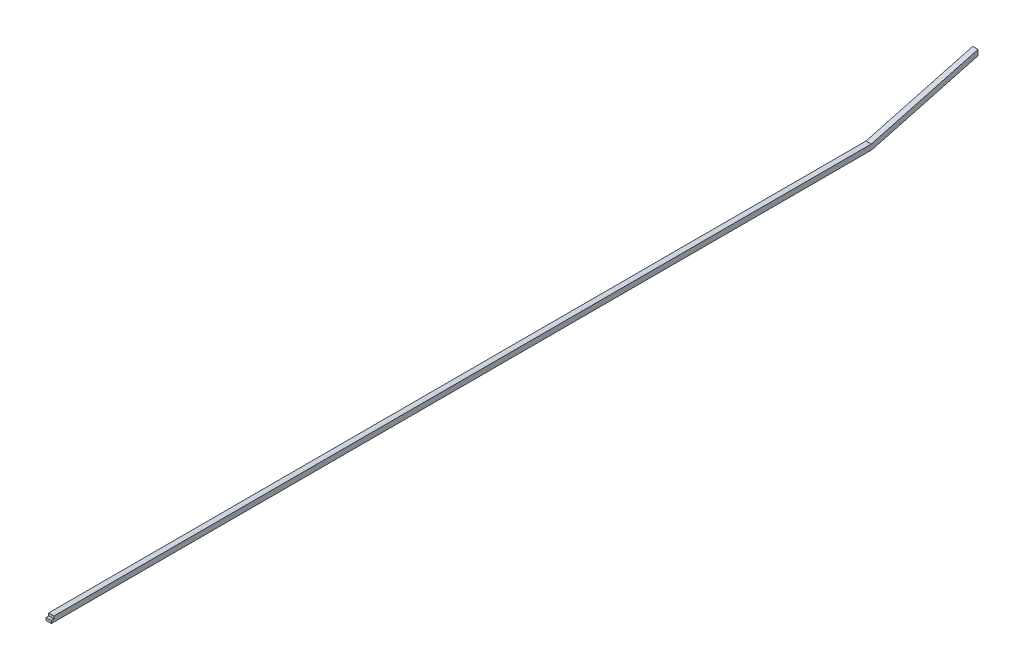
ISO-10303-21;
HEADER;
FILE_DESCRIPTION(('STEP AP214'),'2;1');
FILE_NAME('part.step','',(''),(''),'','','');
FILE_SCHEMA(('AUTOMOTIVE_DESIGN { 1 0 10303 214 1 1 1 1 }'));
ENDSEC;
DATA;
#1=APPLICATION_CONTEXT('core data for automotive mechanical design processes');
#2=APPLICATION_PROTOCOL_DEFINITION('international standard','automotive_design',2000,#1);
#3=PRODUCT_CONTEXT('',#1,'mechanical');
#4=PRODUCT('Part','Part','',(#3));
#5=PRODUCT_RELATED_PRODUCT_CATEGORY('part','',(#4));
#6=PRODUCT_DEFINITION_FORMATION('','',#4);
#7=PRODUCT_DEFINITION_CONTEXT('part definition',#1,'design');
#8=PRODUCT_DEFINITION('design','',#6,#7);
#9=PRODUCT_DEFINITION_SHAPE('','',#8);
#10=(LENGTH_UNIT() NAMED_UNIT(*) SI_UNIT(.MILLI.,.METRE.));
#11=(NAMED_UNIT(*) PLANE_ANGLE_UNIT() SI_UNIT($,.RADIAN.));
#12=(NAMED_UNIT(*) SI_UNIT($,.STERADIAN.) SOLID_ANGLE_UNIT());
#13=UNCERTAINTY_MEASURE_WITH_UNIT(LENGTH_MEASURE(1.E-05),#10,'distance_accuracy_value','');
#14=(GEOMETRIC_REPRESENTATION_CONTEXT(3) GLOBAL_UNCERTAINTY_ASSIGNED_CONTEXT((#13)) GLOBAL_UNIT_ASSIGNED_CONTEXT((#10,
#11,#12)) REPRESENTATION_CONTEXT('',''));
#15=CARTESIAN_POINT('',(0.,0.,0.));
#16=DIRECTION('',(0.,0.,1.));
#17=DIRECTION('',(1.,0.,0.));
#18=AXIS2_PLACEMENT_3D('',#15,#16,#17);
#19=CARTESIAN_POINT('',(6.,0.,413.95698399326));
#20=DIRECTION('',(0.,0.,-1.));
#21=DIRECTION('',(-1.,0.,0.));
#22=AXIS2_PLACEMENT_3D('',#19,#20,#21);
#23=PLANE('',#22);
#24=DIRECTION('',(0.,-1.,0.));
#25=VECTOR('',#24,1.);
#26=CARTESIAN_POINT('',(0.,0.,413.95698399326));
#27=LINE('',#26,#25);
#28=CARTESIAN_POINT('',(0.,3.,413.95698399326));
#29=VERTEX_POINT('',#28);
#30=CARTESIAN_POINT('',(0.,0.,413.95698399326));
#31=VERTEX_POINT('',#30);
#32=EDGE_CURVE('E144',#29,#31,#27,.T.);
#33=ORIENTED_EDGE('',*,*,#32,.T.);
#34=DIRECTION('',(-1.,0.,0.));
#35=VECTOR('',#34,1.);
#36=CARTESIAN_POINT('',(6.,0.,413.95698399326));
#37=LINE('',#36,#35);
#38=CARTESIAN_POINT('',(6.,0.,413.95698399326));
#39=VERTEX_POINT('',#38);
#40=EDGE_CURVE('E11',#39,#31,#37,.T.);
#41=ORIENTED_EDGE('',*,*,#40,.F.);
#42=DIRECTION('',(0.,-1.,0.));
#43=VECTOR('',#42,1.);
#44=CARTESIAN_POINT('',(6.,0.,413.95698399326));
#45=LINE('',#44,#43);
#46=CARTESIAN_POINT('',(6.,3.,413.95698399326));
#47=VERTEX_POINT('',#46);
#48=EDGE_CURVE('E166',#47,#39,#45,.T.);
#49=ORIENTED_EDGE('',*,*,#48,.F.);
#50=DIRECTION('',(-1.,0.,0.));
#51=VECTOR('',#50,1.);
#52=CARTESIAN_POINT('',(6.,3.,413.95698399326));
#53=LINE('',#52,#51);
#54=EDGE_CURVE('E140',#47,#29,#53,.T.);
#55=ORIENTED_EDGE('',*,*,#54,.T.);
#56=EDGE_LOOP('',(#33,#41,#49,#55));
#57=FACE_BOUND('',#56,.T.);
#58=ADVANCED_FACE('F43',(#57),#23,.F.);
#59=CARTESIAN_POINT('',(6.,0.,413.95698399326));
#60=DIRECTION('',(0.,1.,0.));
#61=DIRECTION('',(0.,0.,1.));
#62=AXIS2_PLACEMENT_3D('',#59,#60,#61);
#63=PLANE('',#62);
#64=DIRECTION('',(0.,0.,-1.));
#65=VECTOR('',#64,1.);
#66=CARTESIAN_POINT('',(0.,0.,413.95698399326));
#67=LINE('',#66,#65);
#68=CARTESIAN_POINT('',(0.,0.,-514.90301600674));
#69=VERTEX_POINT('',#68);
#70=EDGE_CURVE('E148',#31,#69,#67,.T.);
#71=ORIENTED_EDGE('',*,*,#70,.T.);
#72=DIRECTION('',(-1.,0.,0.));
#73=VECTOR('',#72,1.);
#74=CARTESIAN_POINT('',(6.,0.,-514.90301600674));
#75=LINE('',#74,#73);
#76=CARTESIAN_POINT('',(6.,0.,-514.90301600674));
#77=VERTEX_POINT('',#76);
#78=EDGE_CURVE('E52',#77,#69,#75,.T.);
#79=ORIENTED_EDGE('',*,*,#78,.F.);
#80=DIRECTION('',(0.,0.,-1.));
#81=VECTOR('',#80,1.);
#82=CARTESIAN_POINT('',(6.,0.,413.95698399326));
#83=LINE('',#82,#81);
#84=EDGE_CURVE('E103',#39,#77,#83,.T.);
#85=ORIENTED_EDGE('',*,*,#84,.F.);
#86=ORIENTED_EDGE('',*,*,#40,.T.);
#87=EDGE_LOOP('',(#71,#79,#85,#86));
#88=FACE_BOUND('',#87,.T.);
#89=ADVANCED_FACE('F212',(#88),#63,.F.);
#90=CARTESIAN_POINT('',(6.,0.,-514.90301600674));
#91=DIRECTION('',(0.,0.965925826289068,0.258819045102521));
#92=DIRECTION('',(0.,-0.258819045102521,0.965925826289068));
#93=AXIS2_PLACEMENT_3D('',#90,#91,#92);
#94=PLANE('',#93);
#95=DIRECTION('',(0.,0.258819045102521,-0.965925826289068));
#96=VECTOR('',#95,1.);
#97=CARTESIAN_POINT('',(0.,0.,-514.90301600674));
#98=LINE('',#97,#96);
#99=CARTESIAN_POINT('',(0.,32.1530899730862,-634.899981406631));
#100=VERTEX_POINT('',#99);
#101=EDGE_CURVE('E151',#69,#100,#98,.T.);
#102=ORIENTED_EDGE('',*,*,#101,.T.);
#103=DIRECTION('',(-1.,0.,0.));
#104=VECTOR('',#103,1.);
#105=CARTESIAN_POINT('',(6.,32.1530899730862,-634.899981406631));
#106=LINE('',#105,#104);
#107=CARTESIAN_POINT('',(6.,32.1530899730862,-634.899981406631));
#108=VERTEX_POINT('',#107);
#109=EDGE_CURVE('E177',#108,#100,#106,.T.);
#110=ORIENTED_EDGE('',*,*,#109,.F.);
#111=DIRECTION('',(0.,0.258819045102521,-0.965925826289068));
#112=VECTOR('',#111,1.);
#113=CARTESIAN_POINT('',(6.,0.,-514.90301600674));
#114=LINE('',#113,#112);
#115=EDGE_CURVE('E187',#77,#108,#114,.T.);
#116=ORIENTED_EDGE('',*,*,#115,.F.);
#117=ORIENTED_EDGE('',*,*,#78,.T.);
#118=EDGE_LOOP('',(#102,#110,#116,#117));
#119=FACE_BOUND('',#118,.T.);
#120=ADVANCED_FACE('F185',(#119),#94,.F.);
#121=CARTESIAN_POINT('',(6.,32.1530899730862,-634.899981406631));
#122=DIRECTION('',(0.,0.,1.));
#123=DIRECTION('',(1.,0.,0.));
#124=AXIS2_PLACEMENT_3D('',#121,#122,#123);
#125=PLANE('',#124);
#126=DIRECTION('',(0.,1.,0.));
#127=VECTOR('',#126,1.);
#128=CARTESIAN_POINT('',(0.,32.1530899730862,-634.899981406631));
#129=LINE('',#128,#127);
#130=CARTESIAN_POINT('',(0.,38.3647470555468,-634.899981406631));
#131=VERTEX_POINT('',#130);
#132=EDGE_CURVE('E154',#100,#131,#129,.T.);
#133=ORIENTED_EDGE('',*,*,#132,.T.);
#134=DIRECTION('',(-1.,0.,0.));
#135=VECTOR('',#134,1.);
#136=CARTESIAN_POINT('',(6.,38.3647470555468,-634.899981406631));
#137=LINE('',#136,#135);
#138=CARTESIAN_POINT('',(6.,38.3647470555468,-634.899981406631));
#139=VERTEX_POINT('',#138);
#140=EDGE_CURVE('E173',#139,#131,#137,.T.);
#141=ORIENTED_EDGE('',*,*,#140,.F.);
#142=DIRECTION('',(0.,1.,0.));
#143=VECTOR('',#142,1.);
#144=CARTESIAN_POINT('',(6.,32.1530899730862,-634.899981406631));
#145=LINE('',#144,#143);
#146=EDGE_CURVE('E200',#108,#139,#145,.T.);
#147=ORIENTED_EDGE('',*,*,#146,.F.);
#148=ORIENTED_EDGE('',*,*,#109,.T.);
#149=EDGE_LOOP('',(#133,#141,#147,#148));
#150=FACE_BOUND('',#149,.T.);
#151=ADVANCED_FACE('F195',(#150),#125,.F.);
#152=CARTESIAN_POINT('',(6.,6.,-514.113101021215));
#153=DIRECTION('',(0.,-0.965925826289068,-0.258819045102522));
#154=DIRECTION('',(0.,0.258819045102522,-0.965925826289068));
#155=AXIS2_PLACEMENT_3D('',#152,#153,#154);
#156=PLANE('',#155);
#157=DIRECTION('',(0.,-0.258819045102522,0.965925826289068));
#158=VECTOR('',#157,1.);
#159=CARTESIAN_POINT('',(0.,6.,-514.113101021215));
#160=LINE('',#159,#158);
#161=CARTESIAN_POINT('',(0.,6.,-514.113101021215));
#162=VERTEX_POINT('',#161);
#163=EDGE_CURVE('E157',#131,#162,#160,.T.);
#164=ORIENTED_EDGE('',*,*,#163,.T.);
#165=DIRECTION('',(-1.,0.,0.));
#166=VECTOR('',#165,1.);
#167=CARTESIAN_POINT('',(6.,6.,-514.113101021215));
#168=LINE('',#167,#166);
#169=CARTESIAN_POINT('',(6.,6.,-514.113101021215));
#170=VERTEX_POINT('',#169);
#171=EDGE_CURVE('E133',#170,#162,#168,.T.);
#172=ORIENTED_EDGE('',*,*,#171,.F.);
#173=DIRECTION('',(0.,-0.258819045102522,0.965925826289068));
#174=VECTOR('',#173,1.);
#175=CARTESIAN_POINT('',(6.,6.,-514.113101021215));
#176=LINE('',#175,#174);
#177=EDGE_CURVE('E122',#139,#170,#176,.T.);
#178=ORIENTED_EDGE('',*,*,#177,.F.);
#179=ORIENTED_EDGE('',*,*,#140,.T.);
#180=EDGE_LOOP('',(#164,#172,#178,#179));
#181=FACE_BOUND('',#180,.T.);
#182=ADVANCED_FACE('F198',(#181),#156,.F.);
#183=CARTESIAN_POINT('',(6.,6.,410.95698399326));
#184=DIRECTION('',(0.,-1.,0.));
#185=DIRECTION('',(0.,0.,-1.));
#186=AXIS2_PLACEMENT_3D('',#183,#184,#185);
#187=PLANE('',#186);
#188=DIRECTION('',(0.,0.,1.));
#189=VECTOR('',#188,1.);
#190=CARTESIAN_POINT('',(0.,6.,410.95698399326));
#191=LINE('',#190,#189);
#192=CARTESIAN_POINT('',(0.,6.,410.95698399326));
#193=VERTEX_POINT('',#192);
#194=EDGE_CURVE('E131',#162,#193,#191,.T.);
#195=ORIENTED_EDGE('',*,*,#194,.T.);
#196=DIRECTION('',(-1.,0.,0.));
#197=VECTOR('',#196,1.);
#198=CARTESIAN_POINT('',(6.,6.,410.95698399326));
#199=LINE('',#198,#197);
#200=CARTESIAN_POINT('',(6.,6.,410.95698399326));
#201=VERTEX_POINT('',#200);
#202=EDGE_CURVE('E128',#201,#193,#199,.T.);
#203=ORIENTED_EDGE('',*,*,#202,.F.);
#204=DIRECTION('',(0.,0.,1.));
#205=VECTOR('',#204,1.);
#206=CARTESIAN_POINT('',(6.,6.,410.95698399326));
#207=LINE('',#206,#205);
#208=EDGE_CURVE('E116',#170,#201,#207,.T.);
#209=ORIENTED_EDGE('',*,*,#208,.F.);
#210=ORIENTED_EDGE('',*,*,#171,.T.);
#211=EDGE_LOOP('',(#195,#203,#209,#210));
#212=FACE_BOUND('',#211,.T.);
#213=ADVANCED_FACE('F129',(#212),#187,.F.);
#214=CARTESIAN_POINT('',(6.,3.,410.95698399326));
#215=DIRECTION('',(0.,0.,-1.));
#216=DIRECTION('',(-1.,0.,0.));
#217=AXIS2_PLACEMENT_3D('',#214,#215,#216);
#218=PLANE('',#217);
#219=DIRECTION('',(0.,-1.,0.));
#220=VECTOR('',#219,1.);
#221=CARTESIAN_POINT('',(0.,3.,410.95698399326));
#222=LINE('',#221,#220);
#223=CARTESIAN_POINT('',(0.,3.,410.95698399326));
#224=VERTEX_POINT('',#223);
#225=EDGE_CURVE('E89',#193,#224,#222,.T.);
#226=ORIENTED_EDGE('',*,*,#225,.T.);
#227=DIRECTION('',(-1.,0.,0.));
#228=VECTOR('',#227,1.);
#229=CARTESIAN_POINT('',(6.,3.,410.95698399326));
#230=LINE('',#229,#228);
#231=CARTESIAN_POINT('',(6.,3.,410.95698399326));
#232=VERTEX_POINT('',#231);
#233=EDGE_CURVE('E134',#232,#224,#230,.T.);
#234=ORIENTED_EDGE('',*,*,#233,.F.);
#235=DIRECTION('',(0.,-1.,0.));
#236=VECTOR('',#235,1.);
#237=CARTESIAN_POINT('',(6.,3.,410.95698399326));
#238=LINE('',#237,#236);
#239=EDGE_CURVE('E120',#201,#232,#238,.T.);
#240=ORIENTED_EDGE('',*,*,#239,.F.);
#241=ORIENTED_EDGE('',*,*,#202,.T.);
#242=EDGE_LOOP('',(#226,#234,#240,#241));
#243=FACE_BOUND('',#242,.T.);
#244=ADVANCED_FACE('F136',(#243),#218,.F.);
#245=CARTESIAN_POINT('',(6.,3.,413.95698399326));
#246=DIRECTION('',(0.,-1.,0.));
#247=DIRECTION('',(0.,0.,-1.));
#248=AXIS2_PLACEMENT_3D('',#245,#246,#247);
#249=PLANE('',#248);
#250=DIRECTION('',(0.,0.,1.));
#251=VECTOR('',#250,1.);
#252=CARTESIAN_POINT('',(0.,3.,413.95698399326));
#253=LINE('',#252,#251);
#254=EDGE_CURVE('E95',#224,#29,#253,.T.);
#255=ORIENTED_EDGE('',*,*,#254,.T.);
#256=ORIENTED_EDGE('',*,*,#54,.F.);
#257=DIRECTION('',(0.,0.,1.));
#258=VECTOR('',#257,1.);
#259=CARTESIAN_POINT('',(6.,3.,413.95698399326));
#260=LINE('',#259,#258);
#261=EDGE_CURVE('E60',#232,#47,#260,.T.);
#262=ORIENTED_EDGE('',*,*,#261,.F.);
#263=ORIENTED_EDGE('',*,*,#233,.T.);
#264=EDGE_LOOP('',(#255,#256,#262,#263));
#265=FACE_BOUND('',#264,.T.);
#266=ADVANCED_FACE('F228',(#265),#249,.F.);
#267=CARTESIAN_POINT('',(6.,0.,0.));
#268=DIRECTION('',(-1.,0.,0.));
#269=DIRECTION('',(0.,0.,1.));
#270=AXIS2_PLACEMENT_3D('',#267,#268,#269);
#271=PLANE('',#270);
#272=ORIENTED_EDGE('',*,*,#48,.T.);
#273=ORIENTED_EDGE('',*,*,#84,.T.);
#274=ORIENTED_EDGE('',*,*,#115,.T.);
#275=ORIENTED_EDGE('',*,*,#146,.T.);
#276=ORIENTED_EDGE('',*,*,#177,.T.);
#277=ORIENTED_EDGE('',*,*,#208,.T.);
#278=ORIENTED_EDGE('',*,*,#239,.T.);
#279=ORIENTED_EDGE('',*,*,#261,.T.);
#280=EDGE_LOOP('',(#272,#273,#274,#275,#276,#277,#278,#279));
#281=FACE_BOUND('',#280,.T.);
#282=ADVANCED_FACE('F118',(#281),#271,.F.);
#283=CARTESIAN_POINT('',(0.,0.,0.));
#284=DIRECTION('',(-1.,0.,0.));
#285=DIRECTION('',(0.,0.,1.));
#286=AXIS2_PLACEMENT_3D('',#283,#284,#285);
#287=PLANE('',#286);
#288=ORIENTED_EDGE('',*,*,#32,.F.);
#289=ORIENTED_EDGE('',*,*,#254,.F.);
#290=ORIENTED_EDGE('',*,*,#225,.F.);
#291=ORIENTED_EDGE('',*,*,#194,.F.);
#292=ORIENTED_EDGE('',*,*,#163,.F.);
#293=ORIENTED_EDGE('',*,*,#132,.F.);
#294=ORIENTED_EDGE('',*,*,#101,.F.);
#295=ORIENTED_EDGE('',*,*,#70,.F.);
#296=EDGE_LOOP('',(#288,#289,#290,#291,#292,#293,#294,#295));
#297=FACE_BOUND('',#296,.T.);
#298=ADVANCED_FACE('F191',(#297),#287,.T.);
#299=CLOSED_SHELL('',(#58,#89,#120,#151,#182,#213,#244,#266,#282,#298));
#300=MANIFOLD_SOLID_BREP('B2',#299);
#301=ADVANCED_BREP_SHAPE_REPRESENTATION('',(#18,#300),#14);
#302=SHAPE_DEFINITION_REPRESENTATION(#9,#301);
ENDSEC;
END-ISO-10303-21;
